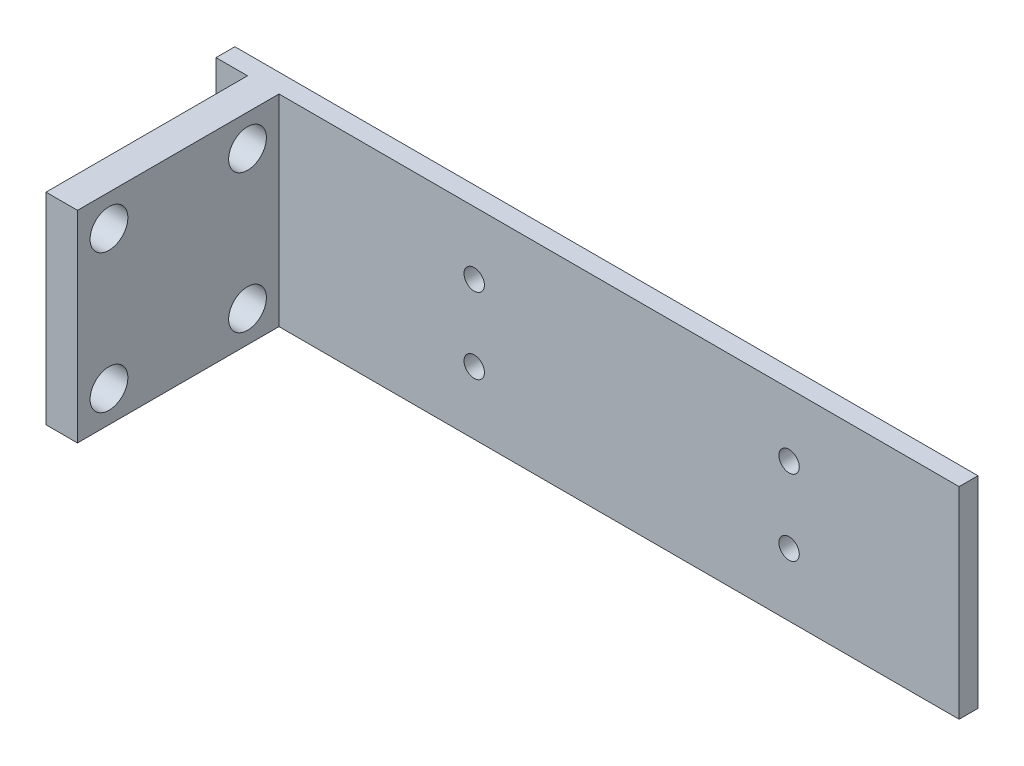
ISO-10303-21;
HEADER;
FILE_DESCRIPTION(('STEP AP214'),'2;1');
FILE_NAME('part.step','',(''),(''),'','','');
FILE_SCHEMA(('AUTOMOTIVE_DESIGN { 1 0 10303 214 1 1 1 1 }'));
ENDSEC;
DATA;
#1=APPLICATION_CONTEXT('core data for automotive mechanical design processes');
#2=APPLICATION_PROTOCOL_DEFINITION('international standard','automotive_design',2000,#1);
#3=PRODUCT_CONTEXT('',#1,'mechanical');
#4=PRODUCT('Part','Part','',(#3));
#5=PRODUCT_RELATED_PRODUCT_CATEGORY('part','',(#4));
#6=PRODUCT_DEFINITION_FORMATION('','',#4);
#7=PRODUCT_DEFINITION_CONTEXT('part definition',#1,'design');
#8=PRODUCT_DEFINITION('design','',#6,#7);
#9=PRODUCT_DEFINITION_SHAPE('','',#8);
#10=(LENGTH_UNIT() NAMED_UNIT(*) SI_UNIT(.MILLI.,.METRE.));
#11=(NAMED_UNIT(*) PLANE_ANGLE_UNIT() SI_UNIT($,.RADIAN.));
#12=(NAMED_UNIT(*) SI_UNIT($,.STERADIAN.) SOLID_ANGLE_UNIT());
#13=UNCERTAINTY_MEASURE_WITH_UNIT(LENGTH_MEASURE(1.E-05),#10,'distance_accuracy_value','');
#14=(GEOMETRIC_REPRESENTATION_CONTEXT(3) GLOBAL_UNCERTAINTY_ASSIGNED_CONTEXT((#13)) GLOBAL_UNIT_ASSIGNED_CONTEXT((#10,
#11,#12)) REPRESENTATION_CONTEXT('',''));
#15=CARTESIAN_POINT('',(0.,0.,0.));
#16=DIRECTION('',(0.,0.,1.));
#17=DIRECTION('',(1.,0.,0.));
#18=AXIS2_PLACEMENT_3D('',#15,#16,#17);
#19=CARTESIAN_POINT('',(0.,0.,3.));
#20=DIRECTION('',(0.,0.,1.));
#21=DIRECTION('',(1.,0.,0.));
#22=AXIS2_PLACEMENT_3D('',#19,#20,#21);
#23=PLANE('',#22);
#24=DIRECTION('',(0.,-1.,0.));
#25=VECTOR('',#24,1.);
#26=CARTESIAN_POINT('',(-66.2816326530612,22.7170068027211,3.));
#27=LINE('',#26,#25);
#28=CARTESIAN_POINT('',(-66.2816326530612,22.7170068027211,3.));
#29=VERTEX_POINT('',#28);
#30=CARTESIAN_POINT('',(-66.2816326530612,-9.28299319727892,3.));
#31=VERTEX_POINT('',#30);
#32=EDGE_CURVE('E58',#29,#31,#27,.T.);
#33=ORIENTED_EDGE('',*,*,#32,.F.);
#34=DIRECTION('',(-1.,0.,0.));
#35=VECTOR('',#34,1.);
#36=CARTESIAN_POINT('',(-71.2816326530612,22.7170068027211,3.));
#37=LINE('',#36,#35);
#38=CARTESIAN_POINT('',(-71.2816326530612,22.7170068027211,3.));
#39=VERTEX_POINT('',#38);
#40=EDGE_CURVE('E168',#29,#39,#37,.T.);
#41=ORIENTED_EDGE('',*,*,#40,.T.);
#42=DIRECTION('',(0.,-1.,0.));
#43=VECTOR('',#42,1.);
#44=CARTESIAN_POINT('',(-71.2816326530612,22.7170068027211,3.));
#45=LINE('',#44,#43);
#46=CARTESIAN_POINT('',(-71.2816326530612,-9.28299319727892,3.));
#47=VERTEX_POINT('',#46);
#48=EDGE_CURVE('E159',#39,#47,#45,.T.);
#49=ORIENTED_EDGE('',*,*,#48,.T.);
#50=DIRECTION('',(1.,0.,0.));
#51=VECTOR('',#50,1.);
#52=CARTESIAN_POINT('',(-71.2816326530612,-9.28299319727892,3.));
#53=LINE('',#52,#51);
#54=EDGE_CURVE('E164',#47,#31,#53,.T.);
#55=ORIENTED_EDGE('',*,*,#54,.T.);
#56=EDGE_LOOP('',(#33,#41,#49,#55));
#57=FACE_BOUND('',#56,.T.);
#58=ADVANCED_FACE('F41',(#57),#23,.T.);
#59=CARTESIAN_POINT('',(-71.2816326530612,22.7170068027211,3.));
#60=DIRECTION('',(1.,0.,0.));
#61=DIRECTION('',(0.,0.,-1.));
#62=AXIS2_PLACEMENT_3D('',#59,#60,#61);
#63=PLANE('',#62);
#64=DIRECTION('',(0.,-1.,0.));
#65=VECTOR('',#64,1.);
#66=CARTESIAN_POINT('',(-71.2816326530612,22.7170068027211,0.));
#67=LINE('',#66,#65);
#68=CARTESIAN_POINT('',(-71.2816326530612,22.7170068027211,0.));
#69=VERTEX_POINT('',#68);
#70=CARTESIAN_POINT('',(-71.2816326530612,-9.28299319727892,0.));
#71=VERTEX_POINT('',#70);
#72=EDGE_CURVE('E156',#69,#71,#67,.T.);
#73=ORIENTED_EDGE('',*,*,#72,.T.);
#74=DIRECTION('',(0.,0.,-1.));
#75=VECTOR('',#74,1.);
#76=CARTESIAN_POINT('',(-71.2816326530612,-9.28299319727892,3.));
#77=LINE('',#76,#75);
#78=EDGE_CURVE('E11',#47,#71,#77,.T.);
#79=ORIENTED_EDGE('',*,*,#78,.F.);
#80=ORIENTED_EDGE('',*,*,#48,.F.);
#81=DIRECTION('',(0.,0.,-1.));
#82=VECTOR('',#81,1.);
#83=CARTESIAN_POINT('',(-71.2816326530612,22.7170068027211,3.));
#84=LINE('',#83,#82);
#85=EDGE_CURVE('E171',#39,#69,#84,.T.);
#86=ORIENTED_EDGE('',*,*,#85,.T.);
#87=EDGE_LOOP('',(#73,#79,#80,#86));
#88=FACE_BOUND('',#87,.T.);
#89=ADVANCED_FACE('F43',(#88),#63,.F.);
#90=CARTESIAN_POINT('',(-71.2816326530612,-9.28299319727892,3.));
#91=DIRECTION('',(0.,1.,0.));
#92=DIRECTION('',(0.,0.,1.));
#93=AXIS2_PLACEMENT_3D('',#90,#91,#92);
#94=PLANE('',#93);
#95=DIRECTION('',(1.,0.,0.));
#96=VECTOR('',#95,1.);
#97=CARTESIAN_POINT('',(-71.2816326530612,-9.28299319727892,0.));
#98=LINE('',#97,#96);
#99=CARTESIAN_POINT('',(46.7183673469388,-9.28299319727892,0.));
#100=VERTEX_POINT('',#99);
#101=EDGE_CURVE('E174',#71,#100,#98,.T.);
#102=ORIENTED_EDGE('',*,*,#101,.T.);
#103=DIRECTION('',(0.,0.,-1.));
#104=VECTOR('',#103,1.);
#105=CARTESIAN_POINT('',(46.7183673469388,-9.28299319727892,3.));
#106=LINE('',#105,#104);
#107=CARTESIAN_POINT('',(46.7183673469388,-9.28299319727892,3.));
#108=VERTEX_POINT('',#107);
#109=EDGE_CURVE('E50',#108,#100,#106,.T.);
#110=ORIENTED_EDGE('',*,*,#109,.F.);
#111=CARTESIAN_POINT('',(-61.2816326530612,-9.28299319727892,3.));
#112=VERTEX_POINT('',#111);
#113=EDGE_CURVE('E162',#112,#108,#53,.T.);
#114=ORIENTED_EDGE('',*,*,#113,.F.);
#115=DIRECTION('',(0.,0.,-1.));
#116=VECTOR('',#115,1.);
#117=CARTESIAN_POINT('',(-61.2816326530612,-9.28299319727892,35.));
#118=LINE('',#117,#116);
#119=CARTESIAN_POINT('',(-61.2816326530612,-9.28299319727892,35.));
#120=VERTEX_POINT('',#119);
#121=EDGE_CURVE('E114',#120,#112,#118,.T.);
#122=ORIENTED_EDGE('',*,*,#121,.F.);
#123=DIRECTION('',(1.,0.,0.));
#124=VECTOR('',#123,1.);
#125=CARTESIAN_POINT('',(-66.2816326530612,-9.28299319727892,35.));
#126=LINE('',#125,#124);
#127=CARTESIAN_POINT('',(-66.2816326530612,-9.28299319727892,35.));
#128=VERTEX_POINT('',#127);
#129=EDGE_CURVE('E108',#128,#120,#126,.T.);
#130=ORIENTED_EDGE('',*,*,#129,.F.);
#131=DIRECTION('',(0.,0.,-1.));
#132=VECTOR('',#131,1.);
#133=CARTESIAN_POINT('',(-66.2816326530612,-9.28299319727892,35.));
#134=LINE('',#133,#132);
#135=EDGE_CURVE('E112',#128,#31,#134,.T.);
#136=ORIENTED_EDGE('',*,*,#135,.T.);
#137=ORIENTED_EDGE('',*,*,#54,.F.);
#138=ORIENTED_EDGE('',*,*,#78,.T.);
#139=EDGE_LOOP('',(#102,#110,#114,#122,#130,#136,#137,#138));
#140=FACE_BOUND('',#139,.T.);
#141=ADVANCED_FACE('F110',(#140),#94,.F.);
#142=CARTESIAN_POINT('',(46.7183673469388,22.7170068027211,3.));
#143=DIRECTION('',(-1.,0.,0.));
#144=DIRECTION('',(0.,0.,1.));
#145=AXIS2_PLACEMENT_3D('',#142,#143,#144);
#146=PLANE('',#145);
#147=DIRECTION('',(0.,1.,0.));
#148=VECTOR('',#147,1.);
#149=CARTESIAN_POINT('',(46.7183673469388,22.7170068027211,0.));
#150=LINE('',#149,#148);
#151=CARTESIAN_POINT('',(46.7183673469388,22.7170068027211,0.));
#152=VERTEX_POINT('',#151);
#153=EDGE_CURVE('E176',#100,#152,#150,.T.);
#154=ORIENTED_EDGE('',*,*,#153,.T.);
#155=DIRECTION('',(0.,0.,-1.));
#156=VECTOR('',#155,1.);
#157=CARTESIAN_POINT('',(46.7183673469388,22.7170068027211,3.));
#158=LINE('',#157,#156);
#159=CARTESIAN_POINT('',(46.7183673469388,22.7170068027211,3.));
#160=VERTEX_POINT('',#159);
#161=EDGE_CURVE('E181',#160,#152,#158,.T.);
#162=ORIENTED_EDGE('',*,*,#161,.F.);
#163=DIRECTION('',(0.,1.,0.));
#164=VECTOR('',#163,1.);
#165=CARTESIAN_POINT('',(46.7183673469388,22.7170068027211,3.));
#166=LINE('',#165,#164);
#167=EDGE_CURVE('E166',#108,#160,#166,.T.);
#168=ORIENTED_EDGE('',*,*,#167,.F.);
#169=ORIENTED_EDGE('',*,*,#109,.T.);
#170=EDGE_LOOP('',(#154,#162,#168,#169));
#171=FACE_BOUND('',#170,.T.);
#172=ADVANCED_FACE('F254',(#171),#146,.F.);
#173=CARTESIAN_POINT('',(-71.2816326530612,22.7170068027211,3.));
#174=DIRECTION('',(0.,-1.,0.));
#175=DIRECTION('',(0.,0.,-1.));
#176=AXIS2_PLACEMENT_3D('',#173,#174,#175);
#177=PLANE('',#176);
#178=DIRECTION('',(-1.,0.,0.));
#179=VECTOR('',#178,1.);
#180=CARTESIAN_POINT('',(-71.2816326530612,22.7170068027211,0.));
#181=LINE('',#180,#179);
#182=EDGE_CURVE('E163',#152,#69,#181,.T.);
#183=ORIENTED_EDGE('',*,*,#182,.T.);
#184=ORIENTED_EDGE('',*,*,#85,.F.);
#185=ORIENTED_EDGE('',*,*,#40,.F.);
#186=DIRECTION('',(0.,0.,-1.));
#187=VECTOR('',#186,1.);
#188=CARTESIAN_POINT('',(-66.2816326530612,22.7170068027211,35.));
#189=LINE('',#188,#187);
#190=CARTESIAN_POINT('',(-66.2816326530612,22.7170068027211,35.));
#191=VERTEX_POINT('',#190);
#192=EDGE_CURVE('E211',#191,#29,#189,.T.);
#193=ORIENTED_EDGE('',*,*,#192,.F.);
#194=DIRECTION('',(-1.,0.,0.));
#195=VECTOR('',#194,1.);
#196=CARTESIAN_POINT('',(-66.2816326530612,22.7170068027211,35.));
#197=LINE('',#196,#195);
#198=CARTESIAN_POINT('',(-61.2816326530612,22.7170068027211,35.));
#199=VERTEX_POINT('',#198);
#200=EDGE_CURVE('E123',#199,#191,#197,.T.);
#201=ORIENTED_EDGE('',*,*,#200,.F.);
#202=DIRECTION('',(0.,0.,-1.));
#203=VECTOR('',#202,1.);
#204=CARTESIAN_POINT('',(-61.2816326530612,22.7170068027211,35.));
#205=LINE('',#204,#203);
#206=CARTESIAN_POINT('',(-61.2816326530612,22.7170068027211,3.));
#207=VERTEX_POINT('',#206);
#208=EDGE_CURVE('E134',#199,#207,#205,.T.);
#209=ORIENTED_EDGE('',*,*,#208,.T.);
#210=EDGE_CURVE('E169',#160,#207,#37,.T.);
#211=ORIENTED_EDGE('',*,*,#210,.F.);
#212=ORIENTED_EDGE('',*,*,#161,.T.);
#213=EDGE_LOOP('',(#183,#184,#185,#193,#201,#209,#211,#212));
#214=FACE_BOUND('',#213,.T.);
#215=ADVANCED_FACE('F218',(#214),#177,.F.);
#216=DIRECTION('',(0.,1.,0.));
#217=VECTOR('',#216,1.);
#218=CARTESIAN_POINT('',(-61.2816326530612,22.7170068027211,3.));
#219=LINE('',#218,#217);
#220=EDGE_CURVE('E66',#112,#207,#219,.T.);
#221=ORIENTED_EDGE('',*,*,#220,.F.);
#222=ORIENTED_EDGE('',*,*,#113,.T.);
#223=ORIENTED_EDGE('',*,*,#167,.T.);
#224=ORIENTED_EDGE('',*,*,#210,.T.);
#225=EDGE_LOOP('',(#221,#222,#223,#224));
#226=FACE_BOUND('',#225,.T.);
#227=CARTESIAN_POINT('',(-30.2816326530612,0.717006802721081,3.));
#228=DIRECTION('',(0.,0.,1.));
#229=DIRECTION('',(1.,0.,0.));
#230=AXIS2_PLACEMENT_3D('',#227,#228,#229);
#231=CIRCLE('',#230,1.62);
#232=CARTESIAN_POINT('',(-28.6616326530612,0.717006802721081,3.));
#233=VERTEX_POINT('',#232);
#234=EDGE_CURVE('E141',#233,#233,#231,.T.);
#235=ORIENTED_EDGE('',*,*,#234,.F.);
#236=EDGE_LOOP('',(#235));
#237=FACE_BOUND('',#236,.T.);
#238=CARTESIAN_POINT('',(19.7183673469388,12.7170068027211,3.));
#239=DIRECTION('',(0.,0.,1.));
#240=DIRECTION('',(1.,0.,0.));
#241=AXIS2_PLACEMENT_3D('',#238,#239,#240);
#242=CIRCLE('',#241,1.62);
#243=CARTESIAN_POINT('',(21.3383673469388,12.7170068027211,3.));
#244=VERTEX_POINT('',#243);
#245=EDGE_CURVE('E148',#244,#244,#242,.T.);
#246=ORIENTED_EDGE('',*,*,#245,.F.);
#247=EDGE_LOOP('',(#246));
#248=FACE_BOUND('',#247,.T.);
#249=CARTESIAN_POINT('',(19.7183673469388,0.717006802721081,3.));
#250=DIRECTION('',(0.,0.,1.));
#251=DIRECTION('',(1.,0.,0.));
#252=AXIS2_PLACEMENT_3D('',#249,#250,#251);
#253=CIRCLE('',#252,1.62);
#254=CARTESIAN_POINT('',(21.3383673469388,0.717006802721081,3.));
#255=VERTEX_POINT('',#254);
#256=EDGE_CURVE('E132',#255,#255,#253,.T.);
#257=ORIENTED_EDGE('',*,*,#256,.F.);
#258=EDGE_LOOP('',(#257));
#259=FACE_BOUND('',#258,.T.);
#260=CARTESIAN_POINT('',(-30.2816326530612,12.7170068027211,3.));
#261=DIRECTION('',(0.,0.,1.));
#262=DIRECTION('',(1.,0.,0.));
#263=AXIS2_PLACEMENT_3D('',#260,#261,#262);
#264=CIRCLE('',#263,1.62000000000001);
#265=CARTESIAN_POINT('',(-28.6616326530612,12.7170068027211,3.));
#266=VERTEX_POINT('',#265);
#267=EDGE_CURVE('E144',#266,#266,#264,.T.);
#268=ORIENTED_EDGE('',*,*,#267,.F.);
#269=EDGE_LOOP('',(#268));
#270=FACE_BOUND('',#269,.T.);
#271=ADVANCED_FACE('F237',(#226,#237,#248,#259,#270),#23,.T.);
#272=CARTESIAN_POINT('',(0.,0.,0.));
#273=DIRECTION('',(0.,0.,1.));
#274=DIRECTION('',(1.,0.,0.));
#275=AXIS2_PLACEMENT_3D('',#272,#273,#274);
#276=PLANE('',#275);
#277=CARTESIAN_POINT('',(-30.2816326530612,0.717006802721081,0.));
#278=DIRECTION('',(0.,0.,1.));
#279=DIRECTION('',(1.,0.,0.));
#280=AXIS2_PLACEMENT_3D('',#277,#278,#279);
#281=CIRCLE('',#280,1.62);
#282=CARTESIAN_POINT('',(-28.6616326530612,0.717006802721081,0.));
#283=VERTEX_POINT('',#282);
#284=EDGE_CURVE('E145',#283,#283,#281,.T.);
#285=ORIENTED_EDGE('',*,*,#284,.T.);
#286=EDGE_LOOP('',(#285));
#287=FACE_BOUND('',#286,.T.);
#288=CARTESIAN_POINT('',(19.7183673469388,12.7170068027211,0.));
#289=DIRECTION('',(0.,0.,1.));
#290=DIRECTION('',(1.,0.,0.));
#291=AXIS2_PLACEMENT_3D('',#288,#289,#290);
#292=CIRCLE('',#291,1.62);
#293=CARTESIAN_POINT('',(21.3383673469388,12.7170068027211,0.));
#294=VERTEX_POINT('',#293);
#295=EDGE_CURVE('E139',#294,#294,#292,.T.);
#296=ORIENTED_EDGE('',*,*,#295,.T.);
#297=EDGE_LOOP('',(#296));
#298=FACE_BOUND('',#297,.T.);
#299=CARTESIAN_POINT('',(19.7183673469388,0.717006802721081,0.));
#300=DIRECTION('',(0.,0.,1.));
#301=DIRECTION('',(1.,0.,0.));
#302=AXIS2_PLACEMENT_3D('',#299,#300,#301);
#303=CIRCLE('',#302,1.62);
#304=CARTESIAN_POINT('',(21.3383673469388,0.717006802721081,0.));
#305=VERTEX_POINT('',#304);
#306=EDGE_CURVE('E129',#305,#305,#303,.T.);
#307=ORIENTED_EDGE('',*,*,#306,.T.);
#308=EDGE_LOOP('',(#307));
#309=FACE_BOUND('',#308,.T.);
#310=CARTESIAN_POINT('',(-30.2816326530612,12.7170068027211,0.));
#311=DIRECTION('',(0.,0.,1.));
#312=DIRECTION('',(1.,0.,0.));
#313=AXIS2_PLACEMENT_3D('',#310,#311,#312);
#314=CIRCLE('',#313,1.62000000000001);
#315=CARTESIAN_POINT('',(-28.6616326530612,12.7170068027211,0.));
#316=VERTEX_POINT('',#315);
#317=EDGE_CURVE('E153',#316,#316,#314,.T.);
#318=ORIENTED_EDGE('',*,*,#317,.T.);
#319=EDGE_LOOP('',(#318));
#320=FACE_BOUND('',#319,.T.);
#321=ORIENTED_EDGE('',*,*,#72,.F.);
#322=ORIENTED_EDGE('',*,*,#182,.F.);
#323=ORIENTED_EDGE('',*,*,#153,.F.);
#324=ORIENTED_EDGE('',*,*,#101,.F.);
#325=EDGE_LOOP('',(#321,#322,#323,#324));
#326=FACE_BOUND('',#325,.T.);
#327=ADVANCED_FACE('F247',(#287,#298,#309,#320,#326),#276,.F.);
#328=CARTESIAN_POINT('',(-30.2816326530612,12.7170068027211,0.));
#329=DIRECTION('',(0.,0.,1.));
#330=DIRECTION('',(1.,0.,0.));
#331=AXIS2_PLACEMENT_3D('',#328,#329,#330);
#332=CYLINDRICAL_SURFACE('',#331,1.62000000000001);
#333=ORIENTED_EDGE('',*,*,#317,.F.);
#334=EDGE_LOOP('',(#333));
#335=FACE_BOUND('',#334,.T.);
#336=ORIENTED_EDGE('',*,*,#267,.T.);
#337=EDGE_LOOP('',(#336));
#338=FACE_BOUND('',#337,.T.);
#339=ADVANCED_FACE('F252',(#335,#338),#332,.F.);
#340=CARTESIAN_POINT('',(19.7183673469388,0.717006802721081,0.));
#341=DIRECTION('',(0.,0.,1.));
#342=DIRECTION('',(1.,0.,0.));
#343=AXIS2_PLACEMENT_3D('',#340,#341,#342);
#344=CYLINDRICAL_SURFACE('',#343,1.62);
#345=ORIENTED_EDGE('',*,*,#306,.F.);
#346=EDGE_LOOP('',(#345));
#347=FACE_BOUND('',#346,.T.);
#348=ORIENTED_EDGE('',*,*,#256,.T.);
#349=EDGE_LOOP('',(#348));
#350=FACE_BOUND('',#349,.T.);
#351=ADVANCED_FACE('F266',(#347,#350),#344,.F.);
#352=CARTESIAN_POINT('',(19.7183673469388,12.7170068027211,0.));
#353=DIRECTION('',(0.,0.,1.));
#354=DIRECTION('',(1.,0.,0.));
#355=AXIS2_PLACEMENT_3D('',#352,#353,#354);
#356=CYLINDRICAL_SURFACE('',#355,1.62);
#357=ORIENTED_EDGE('',*,*,#295,.F.);
#358=EDGE_LOOP('',(#357));
#359=FACE_BOUND('',#358,.T.);
#360=ORIENTED_EDGE('',*,*,#245,.T.);
#361=EDGE_LOOP('',(#360));
#362=FACE_BOUND('',#361,.T.);
#363=ADVANCED_FACE('F271',(#359,#362),#356,.F.);
#364=CARTESIAN_POINT('',(-30.2816326530612,0.717006802721081,0.));
#365=DIRECTION('',(0.,0.,1.));
#366=DIRECTION('',(1.,0.,0.));
#367=AXIS2_PLACEMENT_3D('',#364,#365,#366);
#368=CYLINDRICAL_SURFACE('',#367,1.62);
#369=ORIENTED_EDGE('',*,*,#284,.F.);
#370=EDGE_LOOP('',(#369));
#371=FACE_BOUND('',#370,.T.);
#372=ORIENTED_EDGE('',*,*,#234,.T.);
#373=EDGE_LOOP('',(#372));
#374=FACE_BOUND('',#373,.T.);
#375=ADVANCED_FACE('F231',(#371,#374),#368,.F.);
#376=CARTESIAN_POINT('',(-66.2816326530612,22.7170068027211,35.));
#377=DIRECTION('',(1.,0.,0.));
#378=DIRECTION('',(0.,0.,-1.));
#379=AXIS2_PLACEMENT_3D('',#376,#377,#378);
#380=PLANE('',#379);
#381=CARTESIAN_POINT('',(-66.2816326530612,-4.28299319727892,30.));
#382=DIRECTION('',(1.,0.,0.));
#383=DIRECTION('',(0.,0.,-1.));
#384=AXIS2_PLACEMENT_3D('',#381,#382,#383);
#385=CIRCLE('',#384,3.);
#386=CARTESIAN_POINT('',(-66.2816326530612,-4.28299319727892,27.));
#387=VERTEX_POINT('',#386);
#388=EDGE_CURVE('E206',#387,#387,#385,.T.);
#389=ORIENTED_EDGE('',*,*,#388,.T.);
#390=EDGE_LOOP('',(#389));
#391=FACE_BOUND('',#390,.T.);
#392=CARTESIAN_POINT('',(-66.2816326530612,17.7170068027211,8.));
#393=DIRECTION('',(1.,0.,0.));
#394=DIRECTION('',(0.,0.,-1.));
#395=AXIS2_PLACEMENT_3D('',#392,#393,#394);
#396=CIRCLE('',#395,3.);
#397=CARTESIAN_POINT('',(-66.2816326530612,17.7170068027211,5.));
#398=VERTEX_POINT('',#397);
#399=EDGE_CURVE('E195',#398,#398,#396,.T.);
#400=ORIENTED_EDGE('',*,*,#399,.T.);
#401=EDGE_LOOP('',(#400));
#402=FACE_BOUND('',#401,.T.);
#403=CARTESIAN_POINT('',(-66.2816326530612,-4.28299319727892,8.));
#404=DIRECTION('',(1.,0.,0.));
#405=DIRECTION('',(0.,0.,-1.));
#406=AXIS2_PLACEMENT_3D('',#403,#404,#405);
#407=CIRCLE('',#406,3.);
#408=CARTESIAN_POINT('',(-66.2816326530612,-4.28299319727892,5.));
#409=VERTEX_POINT('',#408);
#410=EDGE_CURVE('E192',#409,#409,#407,.T.);
#411=ORIENTED_EDGE('',*,*,#410,.T.);
#412=EDGE_LOOP('',(#411));
#413=FACE_BOUND('',#412,.T.);
#414=CARTESIAN_POINT('',(-66.2816326530612,17.7170068027211,30.));
#415=DIRECTION('',(1.,0.,0.));
#416=DIRECTION('',(0.,0.,-1.));
#417=AXIS2_PLACEMENT_3D('',#414,#415,#416);
#418=CIRCLE('',#417,3.);
#419=CARTESIAN_POINT('',(-66.2816326530612,17.7170068027211,27.));
#420=VERTEX_POINT('',#419);
#421=EDGE_CURVE('E189',#420,#420,#418,.T.);
#422=ORIENTED_EDGE('',*,*,#421,.T.);
#423=EDGE_LOOP('',(#422));
#424=FACE_BOUND('',#423,.T.);
#425=ORIENTED_EDGE('',*,*,#32,.T.);
#426=ORIENTED_EDGE('',*,*,#135,.F.);
#427=DIRECTION('',(0.,-1.,0.));
#428=VECTOR('',#427,1.);
#429=CARTESIAN_POINT('',(-66.2816326530612,22.7170068027211,35.));
#430=LINE('',#429,#428);
#431=EDGE_CURVE('E118',#191,#128,#430,.T.);
#432=ORIENTED_EDGE('',*,*,#431,.F.);
#433=ORIENTED_EDGE('',*,*,#192,.T.);
#434=EDGE_LOOP('',(#425,#426,#432,#433));
#435=FACE_BOUND('',#434,.T.);
#436=ADVANCED_FACE('F128',(#391,#402,#413,#424,#435),#380,.F.);
#437=CARTESIAN_POINT('',(-61.2816326530612,22.7170068027211,35.));
#438=DIRECTION('',(-1.,0.,0.));
#439=DIRECTION('',(0.,0.,1.));
#440=AXIS2_PLACEMENT_3D('',#437,#438,#439);
#441=PLANE('',#440);
#442=CARTESIAN_POINT('',(-61.2816326530612,-4.28299319727892,30.));
#443=DIRECTION('',(-1.,0.,0.));
#444=DIRECTION('',(0.,0.,1.));
#445=AXIS2_PLACEMENT_3D('',#442,#443,#444);
#446=CIRCLE('',#445,3.);
#447=CARTESIAN_POINT('',(-61.2816326530612,-4.28299319727892,33.));
#448=VERTEX_POINT('',#447);
#449=EDGE_CURVE('E45',#448,#448,#446,.T.);
#450=ORIENTED_EDGE('',*,*,#449,.T.);
#451=EDGE_LOOP('',(#450));
#452=FACE_BOUND('',#451,.T.);
#453=CARTESIAN_POINT('',(-61.2816326530612,17.7170068027211,8.));
#454=DIRECTION('',(-1.,0.,0.));
#455=DIRECTION('',(0.,0.,1.));
#456=AXIS2_PLACEMENT_3D('',#453,#454,#455);
#457=CIRCLE('',#456,3.);
#458=CARTESIAN_POINT('',(-61.2816326530612,17.7170068027211,11.));
#459=VERTEX_POINT('',#458);
#460=EDGE_CURVE('E193',#459,#459,#457,.T.);
#461=ORIENTED_EDGE('',*,*,#460,.T.);
#462=EDGE_LOOP('',(#461));
#463=FACE_BOUND('',#462,.T.);
#464=CARTESIAN_POINT('',(-61.2816326530612,-4.28299319727892,8.));
#465=DIRECTION('',(-1.,0.,0.));
#466=DIRECTION('',(0.,0.,1.));
#467=AXIS2_PLACEMENT_3D('',#464,#465,#466);
#468=CIRCLE('',#467,3.);
#469=CARTESIAN_POINT('',(-61.2816326530612,-4.28299319727892,11.));
#470=VERTEX_POINT('',#469);
#471=EDGE_CURVE('E190',#470,#470,#468,.T.);
#472=ORIENTED_EDGE('',*,*,#471,.T.);
#473=EDGE_LOOP('',(#472));
#474=FACE_BOUND('',#473,.T.);
#475=CARTESIAN_POINT('',(-61.2816326530612,17.7170068027211,30.));
#476=DIRECTION('',(-1.,0.,0.));
#477=DIRECTION('',(0.,0.,1.));
#478=AXIS2_PLACEMENT_3D('',#475,#476,#477);
#479=CIRCLE('',#478,3.);
#480=CARTESIAN_POINT('',(-61.2816326530612,17.7170068027211,33.));
#481=VERTEX_POINT('',#480);
#482=EDGE_CURVE('E186',#481,#481,#479,.T.);
#483=ORIENTED_EDGE('',*,*,#482,.T.);
#484=EDGE_LOOP('',(#483));
#485=FACE_BOUND('',#484,.T.);
#486=ORIENTED_EDGE('',*,*,#220,.T.);
#487=ORIENTED_EDGE('',*,*,#208,.F.);
#488=DIRECTION('',(0.,1.,0.));
#489=VECTOR('',#488,1.);
#490=CARTESIAN_POINT('',(-61.2816326530612,22.7170068027211,35.));
#491=LINE('',#490,#489);
#492=EDGE_CURVE('E117',#120,#199,#491,.T.);
#493=ORIENTED_EDGE('',*,*,#492,.F.);
#494=ORIENTED_EDGE('',*,*,#121,.T.);
#495=EDGE_LOOP('',(#486,#487,#493,#494));
#496=FACE_BOUND('',#495,.T.);
#497=ADVANCED_FACE('F220',(#452,#463,#474,#485,#496),#441,.F.);
#498=CARTESIAN_POINT('',(0.,0.,35.));
#499=DIRECTION('',(0.,0.,1.));
#500=DIRECTION('',(1.,0.,0.));
#501=AXIS2_PLACEMENT_3D('',#498,#499,#500);
#502=PLANE('',#501);
#503=ORIENTED_EDGE('',*,*,#431,.T.);
#504=ORIENTED_EDGE('',*,*,#129,.T.);
#505=ORIENTED_EDGE('',*,*,#492,.T.);
#506=ORIENTED_EDGE('',*,*,#200,.T.);
#507=EDGE_LOOP('',(#503,#504,#505,#506));
#508=FACE_BOUND('',#507,.T.);
#509=ADVANCED_FACE('F121',(#508),#502,.T.);
#510=CARTESIAN_POINT('',(-39.2816326530612,17.7170068027211,30.));
#511=DIRECTION('',(-1.,0.,0.));
#512=DIRECTION('',(0.,0.,1.));
#513=AXIS2_PLACEMENT_3D('',#510,#511,#512);
#514=CYLINDRICAL_SURFACE('',#513,3.);
#515=ORIENTED_EDGE('',*,*,#482,.F.);
#516=EDGE_LOOP('',(#515));
#517=FACE_BOUND('',#516,.T.);
#518=ORIENTED_EDGE('',*,*,#421,.F.);
#519=EDGE_LOOP('',(#518));
#520=FACE_BOUND('',#519,.T.);
#521=ADVANCED_FACE('F229',(#517,#520),#514,.F.);
#522=CARTESIAN_POINT('',(-39.2816326530612,-4.28299319727892,8.));
#523=DIRECTION('',(-1.,0.,0.));
#524=DIRECTION('',(0.,0.,1.));
#525=AXIS2_PLACEMENT_3D('',#522,#523,#524);
#526=CYLINDRICAL_SURFACE('',#525,3.);
#527=ORIENTED_EDGE('',*,*,#471,.F.);
#528=EDGE_LOOP('',(#527));
#529=FACE_BOUND('',#528,.T.);
#530=ORIENTED_EDGE('',*,*,#410,.F.);
#531=EDGE_LOOP('',(#530));
#532=FACE_BOUND('',#531,.T.);
#533=ADVANCED_FACE('F339',(#529,#532),#526,.F.);
#534=CARTESIAN_POINT('',(-39.2816326530612,17.7170068027211,8.));
#535=DIRECTION('',(-1.,0.,0.));
#536=DIRECTION('',(0.,0.,1.));
#537=AXIS2_PLACEMENT_3D('',#534,#535,#536);
#538=CYLINDRICAL_SURFACE('',#537,3.);
#539=ORIENTED_EDGE('',*,*,#460,.F.);
#540=EDGE_LOOP('',(#539));
#541=FACE_BOUND('',#540,.T.);
#542=ORIENTED_EDGE('',*,*,#399,.F.);
#543=EDGE_LOOP('',(#542));
#544=FACE_BOUND('',#543,.T.);
#545=ADVANCED_FACE('F349',(#541,#544),#538,.F.);
#546=CARTESIAN_POINT('',(-39.2816326530612,-4.28299319727892,30.));
#547=DIRECTION('',(-1.,0.,0.));
#548=DIRECTION('',(0.,0.,1.));
#549=AXIS2_PLACEMENT_3D('',#546,#547,#548);
#550=CYLINDRICAL_SURFACE('',#549,3.);
#551=ORIENTED_EDGE('',*,*,#449,.F.);
#552=EDGE_LOOP('',(#551));
#553=FACE_BOUND('',#552,.T.);
#554=ORIENTED_EDGE('',*,*,#388,.F.);
#555=EDGE_LOOP('',(#554));
#556=FACE_BOUND('',#555,.T.);
#557=ADVANCED_FACE('F359',(#553,#556),#550,.F.);
#558=CLOSED_SHELL('',(#58,#89,#141,#172,#215,#271,#327,#339,#351,#363,#375,#436,#497,#509,#521,
#533,#545,#557));
#559=MANIFOLD_SOLID_BREP('B2',#558);
#560=ADVANCED_BREP_SHAPE_REPRESENTATION('',(#18,#559),#14);
#561=SHAPE_DEFINITION_REPRESENTATION(#9,#560);
ENDSEC;
END-ISO-10303-21;
